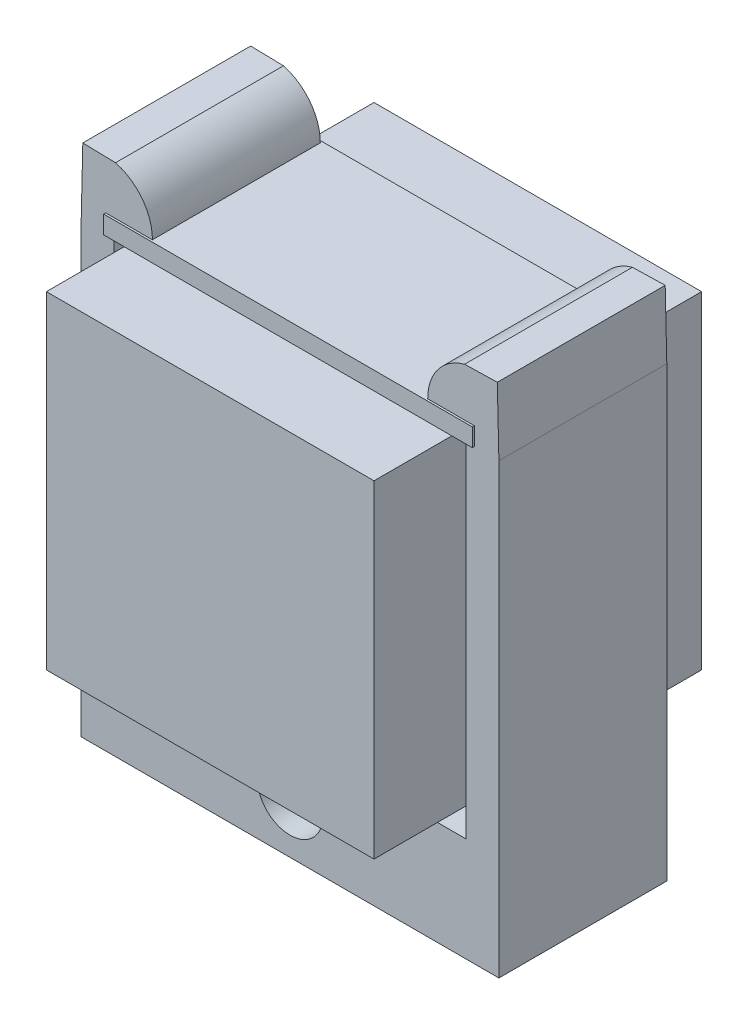
ISO-10303-21;
HEADER;
FILE_DESCRIPTION(('STEP AP214'),'2;1');
FILE_NAME('part.step','',(''),(''),'','','');
FILE_SCHEMA(('AUTOMOTIVE_DESIGN { 1 0 10303 214 1 1 1 1 }'));
ENDSEC;
DATA;
#1=APPLICATION_CONTEXT('core data for automotive mechanical design processes');
#2=APPLICATION_PROTOCOL_DEFINITION('international standard','automotive_design',2000,#1);
#3=PRODUCT_CONTEXT('',#1,'mechanical');
#4=PRODUCT('Part','Part','',(#3));
#5=PRODUCT_RELATED_PRODUCT_CATEGORY('part','',(#4));
#6=PRODUCT_DEFINITION_FORMATION('','',#4);
#7=PRODUCT_DEFINITION_CONTEXT('part definition',#1,'design');
#8=PRODUCT_DEFINITION('design','',#6,#7);
#9=PRODUCT_DEFINITION_SHAPE('','',#8);
#10=(LENGTH_UNIT() NAMED_UNIT(*) SI_UNIT(.MILLI.,.METRE.));
#11=(NAMED_UNIT(*) PLANE_ANGLE_UNIT() SI_UNIT($,.RADIAN.));
#12=(NAMED_UNIT(*) SI_UNIT($,.STERADIAN.) SOLID_ANGLE_UNIT());
#13=UNCERTAINTY_MEASURE_WITH_UNIT(LENGTH_MEASURE(1.E-05),#10,'distance_accuracy_value','');
#14=(GEOMETRIC_REPRESENTATION_CONTEXT(3) GLOBAL_UNCERTAINTY_ASSIGNED_CONTEXT((#13)) GLOBAL_UNIT_ASSIGNED_CONTEXT((#10,
#11,#12)) REPRESENTATION_CONTEXT('',''));
#15=CARTESIAN_POINT('',(0.,0.,0.));
#16=DIRECTION('',(0.,0.,1.));
#17=DIRECTION('',(1.,0.,0.));
#18=AXIS2_PLACEMENT_3D('',#15,#16,#17);
#19=CARTESIAN_POINT('',(-22.8808210284441,2.23350018556867,10.25));
#20=DIRECTION('',(0.,0.,-1.));
#21=DIRECTION('',(-1.,0.,0.));
#22=AXIS2_PLACEMENT_3D('',#19,#20,#21);
#23=CYLINDRICAL_SURFACE('',#22,6.07659216068548);
#24=CARTESIAN_POINT('',(-22.8808210284441,2.23350018556867,-10.25));
#25=DIRECTION('',(0.,0.,1.));
#26=DIRECTION('',(1.,0.,0.));
#27=AXIS2_PLACEMENT_3D('',#24,#25,#26);
#28=CIRCLE('',#27,6.07659216068548);
#29=CARTESIAN_POINT('',(-21.3059505258639,8.10246561291676,-10.25));
#30=VERTEX_POINT('',#29);
#31=CARTESIAN_POINT('',(-16.8059505258639,2.0888604116977,-10.25));
#32=VERTEX_POINT('',#31);
#33=EDGE_CURVE('E201',#30,#32,#28,.F.);
#34=ORIENTED_EDGE('',*,*,#33,.F.);
#35=DIRECTION('',(0.,0.,-1.));
#36=VECTOR('',#35,1.);
#37=CARTESIAN_POINT('',(-21.3059505258639,8.10246561291676,10.25));
#38=LINE('',#37,#36);
#39=CARTESIAN_POINT('',(-21.3059505258639,8.10246561291676,10.25));
#40=VERTEX_POINT('',#39);
#41=EDGE_CURVE('E12',#40,#30,#38,.T.);
#42=ORIENTED_EDGE('',*,*,#41,.F.);
#43=CARTESIAN_POINT('',(-22.8808210284441,2.23350018556867,10.25));
#44=DIRECTION('',(0.,0.,1.));
#45=DIRECTION('',(1.,0.,0.));
#46=AXIS2_PLACEMENT_3D('',#43,#44,#45);
#47=CIRCLE('',#46,6.07659216068548);
#48=CARTESIAN_POINT('',(-16.8059505258639,2.0888604116977,10.25));
#49=VERTEX_POINT('',#48);
#50=EDGE_CURVE('E244',#40,#49,#47,.F.);
#51=ORIENTED_EDGE('',*,*,#50,.T.);
#52=DIRECTION('',(0.,0.,-1.));
#53=VECTOR('',#52,1.);
#54=CARTESIAN_POINT('',(-16.8059505258639,2.0888604116977,10.25));
#55=LINE('',#54,#53);
#56=EDGE_CURVE('E72',#49,#32,#55,.T.);
#57=ORIENTED_EDGE('',*,*,#56,.T.);
#58=EDGE_LOOP('',(#34,#42,#51,#57));
#59=FACE_BOUND('',#58,.T.);
#60=ADVANCED_FACE('F56',(#59),#23,.T.);
#61=CARTESIAN_POINT('',(0.180735187091589,7.59087785784636,10.25));
#62=DIRECTION('',(0.0238027779462901,0.999716673744136,0.));
#63=DIRECTION('',(-0.999716673744136,0.0238027779462901,0.));
#64=AXIS2_PLACEMENT_3D('',#61,#62,#63);
#65=PLANE('',#64);
#66=DIRECTION('',(0.999716673744136,-0.0238027779462901,0.));
#67=VECTOR('',#66,1.);
#68=CARTESIAN_POINT('',(0.180735187091589,7.59087785784636,-10.25));
#69=LINE('',#68,#67);
#70=CARTESIAN_POINT('',(-25.3048172208404,8.19767672470191,-10.25));
#71=VERTEX_POINT('',#70);
#72=EDGE_CURVE('E203',#71,#30,#69,.T.);
#73=ORIENTED_EDGE('',*,*,#72,.F.);
#74=DIRECTION('',(0.,0.,-1.));
#75=VECTOR('',#74,1.);
#76=CARTESIAN_POINT('',(-25.3048172208404,8.19767672470191,10.25));
#77=LINE('',#76,#75);
#78=CARTESIAN_POINT('',(-25.3048172208404,8.19767672470191,10.25));
#79=VERTEX_POINT('',#78);
#80=EDGE_CURVE('E64',#79,#71,#77,.T.);
#81=ORIENTED_EDGE('',*,*,#80,.F.);
#82=DIRECTION('',(0.999716673744136,-0.0238027779462901,0.));
#83=VECTOR('',#82,1.);
#84=CARTESIAN_POINT('',(0.180735187091589,7.59087785784636,10.25));
#85=LINE('',#84,#83);
#86=EDGE_CURVE('E295',#79,#40,#85,.T.);
#87=ORIENTED_EDGE('',*,*,#86,.T.);
#88=ORIENTED_EDGE('',*,*,#41,.T.);
#89=EDGE_LOOP('',(#73,#81,#87,#88));
#90=FACE_BOUND('',#89,.T.);
#91=ADVANCED_FACE('F281',(#90),#65,.T.);
#92=CARTESIAN_POINT('',(-25.485552407932,0.606798866855565,10.25));
#93=DIRECTION('',(-0.999716673744136,0.0238027779462906,0.));
#94=DIRECTION('',(-0.0238027779462906,-0.999716673744136,0.));
#95=AXIS2_PLACEMENT_3D('',#92,#93,#94);
#96=PLANE('',#95);
#97=DIRECTION('',(0.0238027779462906,0.999716673744136,0.));
#98=VECTOR('',#97,1.);
#99=CARTESIAN_POINT('',(-25.485552407932,0.606798866855565,-10.25));
#100=LINE('',#99,#98);
#101=CARTESIAN_POINT('',(-25.5,0.,-10.25));
#102=VERTEX_POINT('',#101);
#103=EDGE_CURVE('E206',#102,#71,#100,.T.);
#104=ORIENTED_EDGE('',*,*,#103,.F.);
#105=DIRECTION('',(0.,0.,-1.));
#106=VECTOR('',#105,1.);
#107=CARTESIAN_POINT('',(-25.5,0.,10.25));
#108=LINE('',#107,#106);
#109=CARTESIAN_POINT('',(-25.5,0.,10.25));
#110=VERTEX_POINT('',#109);
#111=EDGE_CURVE('E270',#110,#102,#108,.T.);
#112=ORIENTED_EDGE('',*,*,#111,.F.);
#113=DIRECTION('',(0.0238027779462906,0.999716673744136,0.));
#114=VECTOR('',#113,1.);
#115=CARTESIAN_POINT('',(-25.485552407932,0.606798866855565,10.25));
#116=LINE('',#115,#114);
#117=EDGE_CURVE('E277',#110,#79,#116,.T.);
#118=ORIENTED_EDGE('',*,*,#117,.T.);
#119=ORIENTED_EDGE('',*,*,#80,.T.);
#120=EDGE_LOOP('',(#104,#112,#118,#119));
#121=FACE_BOUND('',#120,.T.);
#122=ADVANCED_FACE('F275',(#121),#96,.T.);
#123=CARTESIAN_POINT('',(-25.5,0.,10.25));
#124=DIRECTION('',(-1.,0.,0.));
#125=DIRECTION('',(0.,0.,1.));
#126=AXIS2_PLACEMENT_3D('',#123,#124,#125);
#127=PLANE('',#126);
#128=DIRECTION('',(0.,1.,0.));
#129=VECTOR('',#128,1.);
#130=CARTESIAN_POINT('',(-25.5,0.,-10.25));
#131=LINE('',#130,#129);
#132=CARTESIAN_POINT('',(-25.5,-54.7,-10.25));
#133=VERTEX_POINT('',#132);
#134=EDGE_CURVE('E209',#133,#102,#131,.T.);
#135=ORIENTED_EDGE('',*,*,#134,.F.);
#136=DIRECTION('',(0.,0.,-1.));
#137=VECTOR('',#136,1.);
#138=CARTESIAN_POINT('',(-25.5,-54.7,10.25));
#139=LINE('',#138,#137);
#140=CARTESIAN_POINT('',(-25.5,-54.7,10.25));
#141=VERTEX_POINT('',#140);
#142=EDGE_CURVE('E268',#141,#133,#139,.T.);
#143=ORIENTED_EDGE('',*,*,#142,.F.);
#144=DIRECTION('',(0.,1.,0.));
#145=VECTOR('',#144,1.);
#146=CARTESIAN_POINT('',(-25.5,0.,10.25));
#147=LINE('',#146,#145);
#148=EDGE_CURVE('E292',#141,#110,#147,.T.);
#149=ORIENTED_EDGE('',*,*,#148,.T.);
#150=ORIENTED_EDGE('',*,*,#111,.T.);
#151=EDGE_LOOP('',(#135,#143,#149,#150));
#152=FACE_BOUND('',#151,.T.);
#153=ADVANCED_FACE('F289',(#152),#127,.T.);
#154=CARTESIAN_POINT('',(0.,-54.7,10.25));
#155=DIRECTION('',(0.,-1.,0.));
#156=DIRECTION('',(0.,0.,-1.));
#157=AXIS2_PLACEMENT_3D('',#154,#155,#156);
#158=PLANE('',#157);
#159=DIRECTION('',(-1.,0.,0.));
#160=VECTOR('',#159,1.);
#161=CARTESIAN_POINT('',(0.,-54.7,-10.25));
#162=LINE('',#161,#160);
#163=CARTESIAN_POINT('',(25.5,-54.7,-10.25));
#164=VERTEX_POINT('',#163);
#165=EDGE_CURVE('E212',#164,#133,#162,.T.);
#166=ORIENTED_EDGE('',*,*,#165,.F.);
#167=DIRECTION('',(0.,0.,-1.));
#168=VECTOR('',#167,1.);
#169=CARTESIAN_POINT('',(25.5,-54.7,10.25));
#170=LINE('',#169,#168);
#171=CARTESIAN_POINT('',(25.5,-54.7,10.25));
#172=VERTEX_POINT('',#171);
#173=EDGE_CURVE('E266',#172,#164,#170,.T.);
#174=ORIENTED_EDGE('',*,*,#173,.F.);
#175=DIRECTION('',(-1.,0.,0.));
#176=VECTOR('',#175,1.);
#177=CARTESIAN_POINT('',(0.,-54.7,10.25));
#178=LINE('',#177,#176);
#179=EDGE_CURVE('E297',#172,#141,#178,.T.);
#180=ORIENTED_EDGE('',*,*,#179,.T.);
#181=ORIENTED_EDGE('',*,*,#142,.T.);
#182=EDGE_LOOP('',(#166,#174,#180,#181));
#183=FACE_BOUND('',#182,.T.);
#184=ADVANCED_FACE('F344',(#183),#158,.T.);
#185=CARTESIAN_POINT('',(25.5,0.,10.25));
#186=DIRECTION('',(-1.,0.,0.));
#187=DIRECTION('',(0.,0.,1.));
#188=AXIS2_PLACEMENT_3D('',#185,#186,#187);
#189=PLANE('',#188);
#190=DIRECTION('',(0.,1.,0.));
#191=VECTOR('',#190,1.);
#192=CARTESIAN_POINT('',(25.5,0.,-10.25));
#193=LINE('',#192,#191);
#194=CARTESIAN_POINT('',(25.5,0.,-10.25));
#195=VERTEX_POINT('',#194);
#196=EDGE_CURVE('E215',#164,#195,#193,.T.);
#197=ORIENTED_EDGE('',*,*,#196,.T.);
#198=DIRECTION('',(0.,0.,-1.));
#199=VECTOR('',#198,1.);
#200=CARTESIAN_POINT('',(25.5,0.,10.25));
#201=LINE('',#200,#199);
#202=CARTESIAN_POINT('',(25.5,0.,10.25));
#203=VERTEX_POINT('',#202);
#204=EDGE_CURVE('E263',#203,#195,#201,.T.);
#205=ORIENTED_EDGE('',*,*,#204,.F.);
#206=DIRECTION('',(0.,1.,0.));
#207=VECTOR('',#206,1.);
#208=CARTESIAN_POINT('',(25.5,0.,10.25));
#209=LINE('',#208,#207);
#210=EDGE_CURVE('E303',#172,#203,#209,.T.);
#211=ORIENTED_EDGE('',*,*,#210,.F.);
#212=ORIENTED_EDGE('',*,*,#173,.T.);
#213=EDGE_LOOP('',(#197,#205,#211,#212));
#214=FACE_BOUND('',#213,.T.);
#215=ADVANCED_FACE('F347',(#214),#189,.F.);
#216=CARTESIAN_POINT('',(25.485552407932,0.606798866855565,10.25));
#217=DIRECTION('',(-0.999716673744136,-0.0238027779462906,0.));
#218=DIRECTION('',(0.0238027779462906,-0.999716673744136,0.));
#219=AXIS2_PLACEMENT_3D('',#216,#217,#218);
#220=PLANE('',#219);
#221=DIRECTION('',(-0.0238027779462906,0.999716673744136,0.));
#222=VECTOR('',#221,1.);
#223=CARTESIAN_POINT('',(25.485552407932,0.606798866855565,-10.25));
#224=LINE('',#223,#222);
#225=CARTESIAN_POINT('',(25.3048172208404,8.19767672470191,-10.25));
#226=VERTEX_POINT('',#225);
#227=EDGE_CURVE('E217',#195,#226,#224,.T.);
#228=ORIENTED_EDGE('',*,*,#227,.T.);
#229=DIRECTION('',(0.,0.,-1.));
#230=VECTOR('',#229,1.);
#231=CARTESIAN_POINT('',(25.3048172208404,8.19767672470191,10.25));
#232=LINE('',#231,#230);
#233=CARTESIAN_POINT('',(25.3048172208404,8.19767672470191,10.25));
#234=VERTEX_POINT('',#233);
#235=EDGE_CURVE('E260',#234,#226,#232,.T.);
#236=ORIENTED_EDGE('',*,*,#235,.F.);
#237=DIRECTION('',(-0.0238027779462906,0.999716673744136,0.));
#238=VECTOR('',#237,1.);
#239=CARTESIAN_POINT('',(25.485552407932,0.606798866855565,10.25));
#240=LINE('',#239,#238);
#241=EDGE_CURVE('E305',#203,#234,#240,.T.);
#242=ORIENTED_EDGE('',*,*,#241,.F.);
#243=ORIENTED_EDGE('',*,*,#204,.T.);
#244=EDGE_LOOP('',(#228,#236,#242,#243));
#245=FACE_BOUND('',#244,.T.);
#246=ADVANCED_FACE('F351',(#245),#220,.F.);
#247=CARTESIAN_POINT('',(-0.180735187091589,7.59087785784636,10.25));
#248=DIRECTION('',(0.0238027779462901,-0.999716673744136,0.));
#249=DIRECTION('',(0.999716673744136,0.0238027779462901,0.));
#250=AXIS2_PLACEMENT_3D('',#247,#248,#249);
#251=PLANE('',#250);
#252=DIRECTION('',(-0.999716673744136,-0.0238027779462901,0.));
#253=VECTOR('',#252,1.);
#254=CARTESIAN_POINT('',(-0.180735187091589,7.59087785784636,-10.25));
#255=LINE('',#254,#253);
#256=CARTESIAN_POINT('',(21.3059505258639,8.10246561291676,-10.25));
#257=VERTEX_POINT('',#256);
#258=EDGE_CURVE('E219',#226,#257,#255,.T.);
#259=ORIENTED_EDGE('',*,*,#258,.T.);
#260=DIRECTION('',(0.,0.,-1.));
#261=VECTOR('',#260,1.);
#262=CARTESIAN_POINT('',(21.3059505258639,8.10246561291676,10.25));
#263=LINE('',#262,#261);
#264=CARTESIAN_POINT('',(21.3059505258639,8.10246561291676,10.25));
#265=VERTEX_POINT('',#264);
#266=EDGE_CURVE('E257',#265,#257,#263,.T.);
#267=ORIENTED_EDGE('',*,*,#266,.F.);
#268=DIRECTION('',(-0.999716673744136,-0.0238027779462901,0.));
#269=VECTOR('',#268,1.);
#270=CARTESIAN_POINT('',(-0.180735187091589,7.59087785784636,10.25));
#271=LINE('',#270,#269);
#272=EDGE_CURVE('E307',#234,#265,#271,.T.);
#273=ORIENTED_EDGE('',*,*,#272,.F.);
#274=ORIENTED_EDGE('',*,*,#235,.T.);
#275=EDGE_LOOP('',(#259,#267,#273,#274));
#276=FACE_BOUND('',#275,.T.);
#277=ADVANCED_FACE('F355',(#276),#251,.F.);
#278=CARTESIAN_POINT('',(22.8808210284441,2.23350018556867,10.25));
#279=DIRECTION('',(0.,0.,-1.));
#280=DIRECTION('',(-1.,0.,0.));
#281=AXIS2_PLACEMENT_3D('',#278,#279,#280);
#282=CYLINDRICAL_SURFACE('',#281,6.07659216068548);
#283=CARTESIAN_POINT('',(22.8808210284441,2.23350018556867,-10.25));
#284=DIRECTION('',(0.,0.,1.));
#285=DIRECTION('',(1.,0.,0.));
#286=AXIS2_PLACEMENT_3D('',#283,#284,#285);
#287=CIRCLE('',#286,6.07659216068548);
#288=CARTESIAN_POINT('',(16.8059505258639,2.0888604116977,-10.25));
#289=VERTEX_POINT('',#288);
#290=EDGE_CURVE('E221',#257,#289,#287,.T.);
#291=ORIENTED_EDGE('',*,*,#290,.T.);
#292=DIRECTION('',(0.,0.,-1.));
#293=VECTOR('',#292,1.);
#294=CARTESIAN_POINT('',(16.8059505258639,2.0888604116977,10.25));
#295=LINE('',#294,#293);
#296=CARTESIAN_POINT('',(16.8059505258639,2.0888604116977,10.25));
#297=VERTEX_POINT('',#296);
#298=EDGE_CURVE('E254',#297,#289,#295,.T.);
#299=ORIENTED_EDGE('',*,*,#298,.F.);
#300=CARTESIAN_POINT('',(22.8808210284441,2.23350018556867,10.25));
#301=DIRECTION('',(0.,0.,1.));
#302=DIRECTION('',(1.,0.,0.));
#303=AXIS2_PLACEMENT_3D('',#300,#301,#302);
#304=CIRCLE('',#303,6.07659216068548);
#305=EDGE_CURVE('E309',#265,#297,#304,.T.);
#306=ORIENTED_EDGE('',*,*,#305,.F.);
#307=ORIENTED_EDGE('',*,*,#266,.T.);
#308=EDGE_LOOP('',(#291,#299,#306,#307));
#309=FACE_BOUND('',#308,.T.);
#310=ADVANCED_FACE('F359',(#309),#282,.T.);
#311=CARTESIAN_POINT('',(-0.0401848083656906,1.68776195135887,10.25));
#312=DIRECTION('',(-0.0238027779462908,0.999716673744136,0.));
#313=DIRECTION('',(-0.999716673744136,-0.0238027779462908,0.));
#314=AXIS2_PLACEMENT_3D('',#311,#312,#313);
#315=PLANE('',#314);
#316=DIRECTION('',(0.999716673744136,0.0238027779462908,0.));
#317=VECTOR('',#316,1.);
#318=CARTESIAN_POINT('',(-0.0401848083656906,1.68776195135887,-10.25));
#319=LINE('',#318,#317);
#320=CARTESIAN_POINT('',(21.4476338885182,2.1993766822371,-10.25));
#321=VERTEX_POINT('',#320);
#322=EDGE_CURVE('E223',#289,#321,#319,.T.);
#323=ORIENTED_EDGE('',*,*,#322,.T.);
#324=DIRECTION('',(0.,0.,-1.));
#325=VECTOR('',#324,1.);
#326=CARTESIAN_POINT('',(21.4476338885182,2.1993766822371,10.25));
#327=LINE('',#326,#325);
#328=CARTESIAN_POINT('',(21.4476338885182,2.1993766822371,10.25));
#329=VERTEX_POINT('',#328);
#330=EDGE_CURVE('E252',#329,#321,#327,.T.);
#331=ORIENTED_EDGE('',*,*,#330,.F.);
#332=DIRECTION('',(0.999716673744136,0.0238027779462908,0.));
#333=VECTOR('',#332,1.);
#334=CARTESIAN_POINT('',(-0.0401848083656906,1.68776195135887,10.25));
#335=LINE('',#334,#333);
#336=EDGE_CURVE('E311',#297,#329,#335,.T.);
#337=ORIENTED_EDGE('',*,*,#336,.F.);
#338=ORIENTED_EDGE('',*,*,#298,.T.);
#339=EDGE_LOOP('',(#323,#331,#337,#338));
#340=FACE_BOUND('',#339,.T.);
#341=ADVANCED_FACE('F363',(#340),#315,.F.);
#342=CARTESIAN_POINT('',(21.4878186968839,0.511614730878188,10.25));
#343=DIRECTION('',(-0.999716673744136,-0.023802777946289,0.));
#344=DIRECTION('',(0.023802777946289,-0.999716673744136,0.));
#345=AXIS2_PLACEMENT_3D('',#342,#343,#344);
#346=PLANE('',#345);
#347=DIRECTION('',(-0.023802777946289,0.999716673744136,0.));
#348=VECTOR('',#347,1.);
#349=CARTESIAN_POINT('',(21.4878186968839,0.511614730878188,-10.25));
#350=LINE('',#349,#348);
#351=CARTESIAN_POINT('',(21.5,0.,-10.25));
#352=VERTEX_POINT('',#351);
#353=EDGE_CURVE('E226',#352,#321,#350,.T.);
#354=ORIENTED_EDGE('',*,*,#353,.F.);
#355=DIRECTION('',(0.,0.,-1.));
#356=VECTOR('',#355,1.);
#357=CARTESIAN_POINT('',(21.5,0.,10.25));
#358=LINE('',#357,#356);
#359=CARTESIAN_POINT('',(21.5,0.,10.25));
#360=VERTEX_POINT('',#359);
#361=EDGE_CURVE('E250',#360,#352,#358,.T.);
#362=ORIENTED_EDGE('',*,*,#361,.F.);
#363=DIRECTION('',(-0.023802777946289,0.999716673744136,0.));
#364=VECTOR('',#363,1.);
#365=CARTESIAN_POINT('',(21.4878186968839,0.511614730878188,10.25));
#366=LINE('',#365,#364);
#367=EDGE_CURVE('E313',#360,#329,#366,.T.);
#368=ORIENTED_EDGE('',*,*,#367,.T.);
#369=ORIENTED_EDGE('',*,*,#330,.T.);
#370=EDGE_LOOP('',(#354,#362,#368,#369));
#371=FACE_BOUND('',#370,.T.);
#372=ADVANCED_FACE('F367',(#371),#346,.T.);
#373=CARTESIAN_POINT('',(21.5,0.,10.25));
#374=DIRECTION('',(-1.,0.,0.));
#375=DIRECTION('',(0.,0.,1.));
#376=AXIS2_PLACEMENT_3D('',#373,#374,#375);
#377=PLANE('',#376);
#378=DIRECTION('',(0.,1.,0.));
#379=VECTOR('',#378,1.);
#380=CARTESIAN_POINT('',(21.5,0.,-10.25));
#381=LINE('',#380,#379);
#382=CARTESIAN_POINT('',(21.5,-42.,-10.25));
#383=VERTEX_POINT('',#382);
#384=EDGE_CURVE('E229',#383,#352,#381,.T.);
#385=ORIENTED_EDGE('',*,*,#384,.F.);
#386=DIRECTION('',(0.,0.,-1.));
#387=VECTOR('',#386,1.);
#388=CARTESIAN_POINT('',(21.5,-42.,10.25));
#389=LINE('',#388,#387);
#390=CARTESIAN_POINT('',(21.5,-42.,10.25));
#391=VERTEX_POINT('',#390);
#392=EDGE_CURVE('E248',#391,#383,#389,.T.);
#393=ORIENTED_EDGE('',*,*,#392,.F.);
#394=DIRECTION('',(0.,1.,0.));
#395=VECTOR('',#394,1.);
#396=CARTESIAN_POINT('',(21.5,0.,10.25));
#397=LINE('',#396,#395);
#398=EDGE_CURVE('E316',#391,#360,#397,.T.);
#399=ORIENTED_EDGE('',*,*,#398,.T.);
#400=ORIENTED_EDGE('',*,*,#361,.T.);
#401=EDGE_LOOP('',(#385,#393,#399,#400));
#402=FACE_BOUND('',#401,.T.);
#403=ADVANCED_FACE('F371',(#402),#377,.T.);
#404=CARTESIAN_POINT('',(0.,-42.,10.25));
#405=DIRECTION('',(0.,1.,0.));
#406=DIRECTION('',(0.,0.,1.));
#407=AXIS2_PLACEMENT_3D('',#404,#405,#406);
#408=PLANE('',#407);
#409=DIRECTION('',(1.,0.,0.));
#410=VECTOR('',#409,1.);
#411=CARTESIAN_POINT('',(0.,-42.,-10.25));
#412=LINE('',#411,#410);
#413=CARTESIAN_POINT('',(-21.5,-42.,-10.25));
#414=VERTEX_POINT('',#413);
#415=EDGE_CURVE('E232',#414,#383,#412,.T.);
#416=ORIENTED_EDGE('',*,*,#415,.F.);
#417=DIRECTION('',(0.,0.,-1.));
#418=VECTOR('',#417,1.);
#419=CARTESIAN_POINT('',(-21.5,-42.,10.25));
#420=LINE('',#419,#418);
#421=CARTESIAN_POINT('',(-21.5,-42.,10.25));
#422=VERTEX_POINT('',#421);
#423=EDGE_CURVE('E190',#422,#414,#420,.T.);
#424=ORIENTED_EDGE('',*,*,#423,.F.);
#425=DIRECTION('',(1.,0.,0.));
#426=VECTOR('',#425,1.);
#427=CARTESIAN_POINT('',(0.,-42.,10.25));
#428=LINE('',#427,#426);
#429=EDGE_CURVE('E180',#422,#391,#428,.T.);
#430=ORIENTED_EDGE('',*,*,#429,.T.);
#431=ORIENTED_EDGE('',*,*,#392,.T.);
#432=EDGE_LOOP('',(#416,#424,#430,#431));
#433=FACE_BOUND('',#432,.T.);
#434=ADVANCED_FACE('F320',(#433),#408,.T.);
#435=CARTESIAN_POINT('',(-21.5,0.,10.25));
#436=DIRECTION('',(-1.,0.,0.));
#437=DIRECTION('',(0.,0.,1.));
#438=AXIS2_PLACEMENT_3D('',#435,#436,#437);
#439=PLANE('',#438);
#440=DIRECTION('',(0.,1.,0.));
#441=VECTOR('',#440,1.);
#442=CARTESIAN_POINT('',(-21.5,0.,-10.25));
#443=LINE('',#442,#441);
#444=CARTESIAN_POINT('',(-21.5,0.,-10.25));
#445=VERTEX_POINT('',#444);
#446=EDGE_CURVE('E187',#414,#445,#443,.T.);
#447=ORIENTED_EDGE('',*,*,#446,.T.);
#448=DIRECTION('',(0.,0.,-1.));
#449=VECTOR('',#448,1.);
#450=CARTESIAN_POINT('',(-21.5,0.,10.25));
#451=LINE('',#450,#449);
#452=CARTESIAN_POINT('',(-21.5,0.,10.25));
#453=VERTEX_POINT('',#452);
#454=EDGE_CURVE('E184',#453,#445,#451,.T.);
#455=ORIENTED_EDGE('',*,*,#454,.F.);
#456=DIRECTION('',(0.,1.,0.));
#457=VECTOR('',#456,1.);
#458=CARTESIAN_POINT('',(-21.5,0.,10.25));
#459=LINE('',#458,#457);
#460=EDGE_CURVE('E171',#422,#453,#459,.T.);
#461=ORIENTED_EDGE('',*,*,#460,.F.);
#462=ORIENTED_EDGE('',*,*,#423,.T.);
#463=EDGE_LOOP('',(#447,#455,#461,#462));
#464=FACE_BOUND('',#463,.T.);
#465=ADVANCED_FACE('F185',(#464),#439,.F.);
#466=CARTESIAN_POINT('',(-21.4878186968839,0.511614730878188,10.25));
#467=DIRECTION('',(-0.999716673744136,0.023802777946289,0.));
#468=DIRECTION('',(-0.023802777946289,-0.999716673744136,0.));
#469=AXIS2_PLACEMENT_3D('',#466,#467,#468);
#470=PLANE('',#469);
#471=DIRECTION('',(0.023802777946289,0.999716673744136,0.));
#472=VECTOR('',#471,1.);
#473=CARTESIAN_POINT('',(-21.4878186968839,0.511614730878188,-10.25));
#474=LINE('',#473,#472);
#475=CARTESIAN_POINT('',(-21.4476338885182,2.1993766822371,-10.25));
#476=VERTEX_POINT('',#475);
#477=EDGE_CURVE('E236',#445,#476,#474,.T.);
#478=ORIENTED_EDGE('',*,*,#477,.T.);
#479=DIRECTION('',(0.,0.,-1.));
#480=VECTOR('',#479,1.);
#481=CARTESIAN_POINT('',(-21.4476338885182,2.1993766822371,10.25));
#482=LINE('',#481,#480);
#483=CARTESIAN_POINT('',(-21.4476338885182,2.1993766822371,10.25));
#484=VERTEX_POINT('',#483);
#485=EDGE_CURVE('E122',#484,#476,#482,.T.);
#486=ORIENTED_EDGE('',*,*,#485,.F.);
#487=DIRECTION('',(0.023802777946289,0.999716673744136,0.));
#488=VECTOR('',#487,1.);
#489=CARTESIAN_POINT('',(-21.4878186968839,0.511614730878188,10.25));
#490=LINE('',#489,#488);
#491=EDGE_CURVE('E177',#453,#484,#490,.T.);
#492=ORIENTED_EDGE('',*,*,#491,.F.);
#493=ORIENTED_EDGE('',*,*,#454,.T.);
#494=EDGE_LOOP('',(#478,#486,#492,#493));
#495=FACE_BOUND('',#494,.T.);
#496=ADVANCED_FACE('F192',(#495),#470,.F.);
#497=CARTESIAN_POINT('',(0.0401848083656906,1.68776195135887,10.25));
#498=DIRECTION('',(-0.0238027779462908,-0.999716673744136,0.));
#499=DIRECTION('',(0.999716673744136,-0.0238027779462908,0.));
#500=AXIS2_PLACEMENT_3D('',#497,#498,#499);
#501=PLANE('',#500);
#502=DIRECTION('',(-0.999716673744136,0.0238027779462908,0.));
#503=VECTOR('',#502,1.);
#504=CARTESIAN_POINT('',(0.0401848083656906,1.68776195135887,-10.25));
#505=LINE('',#504,#503);
#506=EDGE_CURVE('E238',#32,#476,#505,.T.);
#507=ORIENTED_EDGE('',*,*,#506,.F.);
#508=ORIENTED_EDGE('',*,*,#56,.F.);
#509=DIRECTION('',(-0.999716673744136,0.0238027779462908,0.));
#510=VECTOR('',#509,1.);
#511=CARTESIAN_POINT('',(0.0401848083656906,1.68776195135887,10.25));
#512=LINE('',#511,#510);
#513=EDGE_CURVE('E193',#49,#484,#512,.T.);
#514=ORIENTED_EDGE('',*,*,#513,.T.);
#515=ORIENTED_EDGE('',*,*,#485,.T.);
#516=EDGE_LOOP('',(#507,#508,#514,#515));
#517=FACE_BOUND('',#516,.T.);
#518=ADVANCED_FACE('F322',(#517),#501,.T.);
#519=CARTESIAN_POINT('',(0.,-48.35,10.25));
#520=DIRECTION('',(0.,0.,-1.));
#521=DIRECTION('',(-1.,0.,0.));
#522=AXIS2_PLACEMENT_3D('',#519,#520,#521);
#523=CYLINDRICAL_SURFACE('',#522,4.);
#524=CARTESIAN_POINT('',(0.,-48.35,10.25));
#525=DIRECTION('',(0.,0.,1.));
#526=DIRECTION('',(1.,0.,0.));
#527=AXIS2_PLACEMENT_3D('',#524,#525,#526);
#528=CIRCLE('',#527,4.);
#529=CARTESIAN_POINT('',(4.,-48.35,10.25));
#530=VERTEX_POINT('',#529);
#531=EDGE_CURVE('E195',#530,#530,#528,.T.);
#532=ORIENTED_EDGE('',*,*,#531,.T.);
#533=EDGE_LOOP('',(#532));
#534=FACE_BOUND('',#533,.T.);
#535=CARTESIAN_POINT('',(0.,-48.35,-10.25));
#536=DIRECTION('',(0.,0.,1.));
#537=DIRECTION('',(1.,0.,0.));
#538=AXIS2_PLACEMENT_3D('',#535,#536,#537);
#539=CIRCLE('',#538,4.);
#540=CARTESIAN_POINT('',(4.,-48.35,-10.25));
#541=VERTEX_POINT('',#540);
#542=EDGE_CURVE('E241',#541,#541,#539,.T.);
#543=ORIENTED_EDGE('',*,*,#542,.F.);
#544=EDGE_LOOP('',(#543));
#545=FACE_BOUND('',#544,.T.);
#546=ADVANCED_FACE('F324',(#534,#545),#523,.F.);
#547=CARTESIAN_POINT('',(0.,0.,10.25));
#548=DIRECTION('',(0.,0.,1.));
#549=DIRECTION('',(1.,0.,0.));
#550=AXIS2_PLACEMENT_3D('',#547,#548,#549);
#551=PLANE('',#550);
#552=ORIENTED_EDGE('',*,*,#50,.F.);
#553=ORIENTED_EDGE('',*,*,#86,.F.);
#554=ORIENTED_EDGE('',*,*,#117,.F.);
#555=ORIENTED_EDGE('',*,*,#148,.F.);
#556=ORIENTED_EDGE('',*,*,#179,.F.);
#557=ORIENTED_EDGE('',*,*,#210,.T.);
#558=ORIENTED_EDGE('',*,*,#241,.T.);
#559=ORIENTED_EDGE('',*,*,#272,.T.);
#560=ORIENTED_EDGE('',*,*,#305,.T.);
#561=ORIENTED_EDGE('',*,*,#336,.T.);
#562=ORIENTED_EDGE('',*,*,#367,.F.);
#563=ORIENTED_EDGE('',*,*,#398,.F.);
#564=ORIENTED_EDGE('',*,*,#429,.F.);
#565=ORIENTED_EDGE('',*,*,#460,.T.);
#566=ORIENTED_EDGE('',*,*,#491,.T.);
#567=ORIENTED_EDGE('',*,*,#513,.F.);
#568=EDGE_LOOP('',(#552,#553,#554,#555,#556,#557,#558,#559,#560,#561,#562,#563,#564,#565,#566,#567));
#569=FACE_BOUND('',#568,.T.);
#570=ORIENTED_EDGE('',*,*,#531,.F.);
#571=EDGE_LOOP('',(#570));
#572=FACE_BOUND('',#571,.T.);
#573=ADVANCED_FACE('F173',(#569,#572),#551,.T.);
#574=CARTESIAN_POINT('',(0.,0.,-10.25));
#575=DIRECTION('',(0.,0.,1.));
#576=DIRECTION('',(1.,0.,0.));
#577=AXIS2_PLACEMENT_3D('',#574,#575,#576);
#578=PLANE('',#577);
#579=ORIENTED_EDGE('',*,*,#33,.T.);
#580=ORIENTED_EDGE('',*,*,#506,.T.);
#581=ORIENTED_EDGE('',*,*,#477,.F.);
#582=ORIENTED_EDGE('',*,*,#446,.F.);
#583=ORIENTED_EDGE('',*,*,#415,.T.);
#584=ORIENTED_EDGE('',*,*,#384,.T.);
#585=ORIENTED_EDGE('',*,*,#353,.T.);
#586=ORIENTED_EDGE('',*,*,#322,.F.);
#587=ORIENTED_EDGE('',*,*,#290,.F.);
#588=ORIENTED_EDGE('',*,*,#258,.F.);
#589=ORIENTED_EDGE('',*,*,#227,.F.);
#590=ORIENTED_EDGE('',*,*,#196,.F.);
#591=ORIENTED_EDGE('',*,*,#165,.T.);
#592=ORIENTED_EDGE('',*,*,#134,.T.);
#593=ORIENTED_EDGE('',*,*,#103,.T.);
#594=ORIENTED_EDGE('',*,*,#72,.T.);
#595=EDGE_LOOP('',(#579,#580,#581,#582,#583,#584,#585,#586,#587,#588,#589,#590,#591,#592,#593,#594));
#596=FACE_BOUND('',#595,.T.);
#597=ORIENTED_EDGE('',*,*,#542,.T.);
#598=EDGE_LOOP('',(#597));
#599=FACE_BOUND('',#598,.T.);
#600=ADVANCED_FACE('F283',(#596,#599),#578,.F.);
#601=CLOSED_SHELL('',(#60,#91,#122,#153,#184,#215,#246,#277,#310,#341,#372,#403,#434,#465,#496,
#518,#546,#573,#600));
#602=MANIFOLD_SOLID_BREP('B2',#601);
#603=CARTESIAN_POINT('',(20.,-40.,20.));
#604=DIRECTION('',(1.,0.,0.));
#605=DIRECTION('',(0.,0.,-1.));
#606=AXIS2_PLACEMENT_3D('',#603,#604,#605);
#607=PLANE('',#606);
#608=DIRECTION('',(0.,0.,-1.));
#609=VECTOR('',#608,1.);
#610=CARTESIAN_POINT('',(20.,0.,20.));
#611=LINE('',#610,#609);
#612=CARTESIAN_POINT('',(20.,0.,20.));
#613=VERTEX_POINT('',#612);
#614=CARTESIAN_POINT('',(20.,0.,-20.));
#615=VERTEX_POINT('',#614);
#616=EDGE_CURVE('E654',#613,#615,#611,.T.);
#617=ORIENTED_EDGE('',*,*,#616,.F.);
#618=DIRECTION('',(0.,1.,0.));
#619=VECTOR('',#618,1.);
#620=CARTESIAN_POINT('',(20.,-40.,20.));
#621=LINE('',#620,#619);
#622=CARTESIAN_POINT('',(20.,-40.,20.));
#623=VERTEX_POINT('',#622);
#624=EDGE_CURVE('E54',#623,#613,#621,.T.);
#625=ORIENTED_EDGE('',*,*,#624,.F.);
#626=DIRECTION('',(0.,0.,-1.));
#627=VECTOR('',#626,1.);
#628=CARTESIAN_POINT('',(20.,-40.,20.));
#629=LINE('',#628,#627);
#630=CARTESIAN_POINT('',(20.,-40.,-20.));
#631=VERTEX_POINT('',#630);
#632=EDGE_CURVE('E646',#623,#631,#629,.T.);
#633=ORIENTED_EDGE('',*,*,#632,.T.);
#634=DIRECTION('',(0.,1.,0.));
#635=VECTOR('',#634,1.);
#636=CARTESIAN_POINT('',(20.,-40.,-20.));
#637=LINE('',#636,#635);
#638=EDGE_CURVE('E587',#631,#615,#637,.T.);
#639=ORIENTED_EDGE('',*,*,#638,.T.);
#640=EDGE_LOOP('',(#617,#625,#633,#639));
#641=FACE_BOUND('',#640,.T.);
#642=ADVANCED_FACE('F584',(#641),#607,.T.);
#643=CARTESIAN_POINT('',(-20.,-40.,20.));
#644=DIRECTION('',(0.,0.,1.));
#645=DIRECTION('',(1.,0.,0.));
#646=AXIS2_PLACEMENT_3D('',#643,#644,#645);
#647=PLANE('',#646);
#648=DIRECTION('',(1.,0.,0.));
#649=VECTOR('',#648,1.);
#650=CARTESIAN_POINT('',(-20.,0.,20.));
#651=LINE('',#650,#649);
#652=CARTESIAN_POINT('',(-20.,0.,20.));
#653=VERTEX_POINT('',#652);
#654=EDGE_CURVE('E649',#653,#613,#651,.T.);
#655=ORIENTED_EDGE('',*,*,#654,.F.);
#656=DIRECTION('',(0.,1.,0.));
#657=VECTOR('',#656,1.);
#658=CARTESIAN_POINT('',(-20.,-40.,20.));
#659=LINE('',#658,#657);
#660=CARTESIAN_POINT('',(-20.,-40.,20.));
#661=VERTEX_POINT('',#660);
#662=EDGE_CURVE('E594',#661,#653,#659,.T.);
#663=ORIENTED_EDGE('',*,*,#662,.F.);
#664=DIRECTION('',(1.,0.,0.));
#665=VECTOR('',#664,1.);
#666=CARTESIAN_POINT('',(-20.,-40.,20.));
#667=LINE('',#666,#665);
#668=EDGE_CURVE('E641',#661,#623,#667,.T.);
#669=ORIENTED_EDGE('',*,*,#668,.T.);
#670=ORIENTED_EDGE('',*,*,#624,.T.);
#671=EDGE_LOOP('',(#655,#663,#669,#670));
#672=FACE_BOUND('',#671,.T.);
#673=ADVANCED_FACE('F670',(#672),#647,.T.);
#674=CARTESIAN_POINT('',(-20.,-40.,20.));
#675=DIRECTION('',(-1.,0.,0.));
#676=DIRECTION('',(0.,0.,1.));
#677=AXIS2_PLACEMENT_3D('',#674,#675,#676);
#678=PLANE('',#677);
#679=DIRECTION('',(0.,0.,1.));
#680=VECTOR('',#679,1.);
#681=CARTESIAN_POINT('',(-20.,0.,20.));
#682=LINE('',#681,#680);
#683=CARTESIAN_POINT('',(-20.,0.,-20.));
#684=VERTEX_POINT('',#683);
#685=EDGE_CURVE('E635',#684,#653,#682,.T.);
#686=ORIENTED_EDGE('',*,*,#685,.F.);
#687=DIRECTION('',(0.,1.,0.));
#688=VECTOR('',#687,1.);
#689=CARTESIAN_POINT('',(-20.,-40.,-20.));
#690=LINE('',#689,#688);
#691=CARTESIAN_POINT('',(-20.,-40.,-20.));
#692=VERTEX_POINT('',#691);
#693=EDGE_CURVE('E630',#692,#684,#690,.T.);
#694=ORIENTED_EDGE('',*,*,#693,.F.);
#695=DIRECTION('',(0.,0.,1.));
#696=VECTOR('',#695,1.);
#697=CARTESIAN_POINT('',(-20.,-40.,20.));
#698=LINE('',#697,#696);
#699=EDGE_CURVE('E633',#692,#661,#698,.T.);
#700=ORIENTED_EDGE('',*,*,#699,.T.);
#701=ORIENTED_EDGE('',*,*,#662,.T.);
#702=EDGE_LOOP('',(#686,#694,#700,#701));
#703=FACE_BOUND('',#702,.T.);
#704=ADVANCED_FACE('F632',(#703),#678,.T.);
#705=CARTESIAN_POINT('',(-20.,-40.,-20.));
#706=DIRECTION('',(0.,0.,-1.));
#707=DIRECTION('',(-1.,0.,0.));
#708=AXIS2_PLACEMENT_3D('',#705,#706,#707);
#709=PLANE('',#708);
#710=DIRECTION('',(-1.,0.,0.));
#711=VECTOR('',#710,1.);
#712=CARTESIAN_POINT('',(-20.,0.,-20.));
#713=LINE('',#712,#711);
#714=EDGE_CURVE('E658',#615,#684,#713,.T.);
#715=ORIENTED_EDGE('',*,*,#714,.F.);
#716=ORIENTED_EDGE('',*,*,#638,.F.);
#717=DIRECTION('',(-1.,0.,0.));
#718=VECTOR('',#717,1.);
#719=CARTESIAN_POINT('',(-20.,-40.,-20.));
#720=LINE('',#719,#718);
#721=EDGE_CURVE('E640',#631,#692,#720,.T.);
#722=ORIENTED_EDGE('',*,*,#721,.T.);
#723=ORIENTED_EDGE('',*,*,#693,.T.);
#724=EDGE_LOOP('',(#715,#716,#722,#723));
#725=FACE_BOUND('',#724,.T.);
#726=ADVANCED_FACE('F644',(#725),#709,.T.);
#727=CARTESIAN_POINT('',(0.,-40.,0.));
#728=DIRECTION('',(0.,-1.,0.));
#729=DIRECTION('',(0.,0.,-1.));
#730=AXIS2_PLACEMENT_3D('',#727,#728,#729);
#731=PLANE('',#730);
#732=ORIENTED_EDGE('',*,*,#632,.F.);
#733=ORIENTED_EDGE('',*,*,#668,.F.);
#734=ORIENTED_EDGE('',*,*,#699,.F.);
#735=ORIENTED_EDGE('',*,*,#721,.F.);
#736=EDGE_LOOP('',(#732,#733,#734,#735));
#737=FACE_BOUND('',#736,.T.);
#738=ADVANCED_FACE('F639',(#737),#731,.T.);
#739=CARTESIAN_POINT('',(0.,0.,0.));
#740=DIRECTION('',(0.,-1.,0.));
#741=DIRECTION('',(0.,0.,-1.));
#742=AXIS2_PLACEMENT_3D('',#739,#740,#741);
#743=PLANE('',#742);
#744=ORIENTED_EDGE('',*,*,#616,.T.);
#745=ORIENTED_EDGE('',*,*,#714,.T.);
#746=ORIENTED_EDGE('',*,*,#685,.T.);
#747=ORIENTED_EDGE('',*,*,#654,.T.);
#748=EDGE_LOOP('',(#744,#745,#746,#747));
#749=FACE_BOUND('',#748,.T.);
#750=ADVANCED_FACE('F669',(#749),#743,.F.);
#751=CLOSED_SHELL('',(#642,#673,#704,#726,#738,#750));
#752=MANIFOLD_SOLID_BREP('B6',#751);
#753=CARTESIAN_POINT('',(22.5,2.2,10.5));
#754=DIRECTION('',(-1.,0.,0.));
#755=DIRECTION('',(0.,0.,1.));
#756=AXIS2_PLACEMENT_3D('',#753,#754,#755);
#757=PLANE('',#756);
#758=DIRECTION('',(0.,0.,-1.));
#759=VECTOR('',#758,1.);
#760=CARTESIAN_POINT('',(22.5,0.,10.5));
#761=LINE('',#760,#759);
#762=CARTESIAN_POINT('',(22.5,0.,10.5));
#763=VERTEX_POINT('',#762);
#764=CARTESIAN_POINT('',(22.5,0.,-10.5));
#765=VERTEX_POINT('',#764);
#766=EDGE_CURVE('E795',#763,#765,#761,.T.);
#767=ORIENTED_EDGE('',*,*,#766,.T.);
#768=DIRECTION('',(0.,-1.,0.));
#769=VECTOR('',#768,1.);
#770=CARTESIAN_POINT('',(22.5,2.2,-10.5));
#771=LINE('',#770,#769);
#772=CARTESIAN_POINT('',(22.5,2.2,-10.5));
#773=VERTEX_POINT('',#772);
#774=EDGE_CURVE('E582',#773,#765,#771,.T.);
#775=ORIENTED_EDGE('',*,*,#774,.F.);
#776=DIRECTION('',(0.,0.,-1.));
#777=VECTOR('',#776,1.);
#778=CARTESIAN_POINT('',(22.5,2.2,10.5));
#779=LINE('',#778,#777);
#780=CARTESIAN_POINT('',(22.5,2.2,10.5));
#781=VERTEX_POINT('',#780);
#782=EDGE_CURVE('E783',#781,#773,#779,.T.);
#783=ORIENTED_EDGE('',*,*,#782,.F.);
#784=DIRECTION('',(0.,-1.,0.));
#785=VECTOR('',#784,1.);
#786=CARTESIAN_POINT('',(22.5,2.2,10.5));
#787=LINE('',#786,#785);
#788=EDGE_CURVE('E791',#781,#763,#787,.T.);
#789=ORIENTED_EDGE('',*,*,#788,.T.);
#790=EDGE_LOOP('',(#767,#775,#783,#789));
#791=FACE_BOUND('',#790,.T.);
#792=ADVANCED_FACE('F732',(#791),#757,.F.);
#793=CARTESIAN_POINT('',(-22.5,2.2,-10.5));
#794=DIRECTION('',(0.,0.,1.));
#795=DIRECTION('',(1.,0.,0.));
#796=AXIS2_PLACEMENT_3D('',#793,#794,#795);
#797=PLANE('',#796);
#798=DIRECTION('',(-1.,0.,0.));
#799=VECTOR('',#798,1.);
#800=CARTESIAN_POINT('',(-22.5,0.,-10.5));
#801=LINE('',#800,#799);
#802=CARTESIAN_POINT('',(-22.5,0.,-10.5));
#803=VERTEX_POINT('',#802);
#804=EDGE_CURVE('E787',#765,#803,#801,.T.);
#805=ORIENTED_EDGE('',*,*,#804,.T.);
#806=DIRECTION('',(0.,-1.,0.));
#807=VECTOR('',#806,1.);
#808=CARTESIAN_POINT('',(-22.5,2.2,-10.5));
#809=LINE('',#808,#807);
#810=CARTESIAN_POINT('',(-22.5,2.2,-10.5));
#811=VERTEX_POINT('',#810);
#812=EDGE_CURVE('E740',#811,#803,#809,.T.);
#813=ORIENTED_EDGE('',*,*,#812,.F.);
#814=DIRECTION('',(-1.,0.,0.));
#815=VECTOR('',#814,1.);
#816=CARTESIAN_POINT('',(-22.5,2.2,-10.5));
#817=LINE('',#816,#815);
#818=EDGE_CURVE('E778',#773,#811,#817,.T.);
#819=ORIENTED_EDGE('',*,*,#818,.F.);
#820=ORIENTED_EDGE('',*,*,#774,.T.);
#821=EDGE_LOOP('',(#805,#813,#819,#820));
#822=FACE_BOUND('',#821,.T.);
#823=ADVANCED_FACE('F786',(#822),#797,.F.);
#824=CARTESIAN_POINT('',(-22.5,2.2,10.5));
#825=DIRECTION('',(1.,0.,0.));
#826=DIRECTION('',(0.,0.,-1.));
#827=AXIS2_PLACEMENT_3D('',#824,#825,#826);
#828=PLANE('',#827);
#829=DIRECTION('',(0.,0.,1.));
#830=VECTOR('',#829,1.);
#831=CARTESIAN_POINT('',(-22.5,0.,10.5));
#832=LINE('',#831,#830);
#833=CARTESIAN_POINT('',(-22.5,0.,10.5));
#834=VERTEX_POINT('',#833);
#835=EDGE_CURVE('E765',#803,#834,#832,.T.);
#836=ORIENTED_EDGE('',*,*,#835,.T.);
#837=DIRECTION('',(0.,-1.,0.));
#838=VECTOR('',#837,1.);
#839=CARTESIAN_POINT('',(-22.5,2.2,10.5));
#840=LINE('',#839,#838);
#841=CARTESIAN_POINT('',(-22.5,2.2,10.5));
#842=VERTEX_POINT('',#841);
#843=EDGE_CURVE('E788',#842,#834,#840,.T.);
#844=ORIENTED_EDGE('',*,*,#843,.F.);
#845=DIRECTION('',(0.,0.,1.));
#846=VECTOR('',#845,1.);
#847=CARTESIAN_POINT('',(-22.5,2.2,10.5));
#848=LINE('',#847,#846);
#849=EDGE_CURVE('E781',#811,#842,#848,.T.);
#850=ORIENTED_EDGE('',*,*,#849,.F.);
#851=ORIENTED_EDGE('',*,*,#812,.T.);
#852=EDGE_LOOP('',(#836,#844,#850,#851));
#853=FACE_BOUND('',#852,.T.);
#854=ADVANCED_FACE('F789',(#853),#828,.F.);
#855=CARTESIAN_POINT('',(-22.5,2.2,10.5));
#856=DIRECTION('',(0.,0.,-1.));
#857=DIRECTION('',(-1.,0.,0.));
#858=AXIS2_PLACEMENT_3D('',#855,#856,#857);
#859=PLANE('',#858);
#860=DIRECTION('',(1.,0.,0.));
#861=VECTOR('',#860,1.);
#862=CARTESIAN_POINT('',(-22.5,0.,10.5));
#863=LINE('',#862,#861);
#864=EDGE_CURVE('E771',#834,#763,#863,.T.);
#865=ORIENTED_EDGE('',*,*,#864,.T.);
#866=ORIENTED_EDGE('',*,*,#788,.F.);
#867=DIRECTION('',(1.,0.,0.));
#868=VECTOR('',#867,1.);
#869=CARTESIAN_POINT('',(-22.5,2.2,10.5));
#870=LINE('',#869,#868);
#871=EDGE_CURVE('E748',#842,#781,#870,.T.);
#872=ORIENTED_EDGE('',*,*,#871,.F.);
#873=ORIENTED_EDGE('',*,*,#843,.T.);
#874=EDGE_LOOP('',(#865,#866,#872,#873));
#875=FACE_BOUND('',#874,.T.);
#876=ADVANCED_FACE('F802',(#875),#859,.F.);
#877=CARTESIAN_POINT('',(0.,2.2,0.));
#878=DIRECTION('',(0.,-1.,0.));
#879=DIRECTION('',(0.,0.,-1.));
#880=AXIS2_PLACEMENT_3D('',#877,#878,#879);
#881=PLANE('',#880);
#882=ORIENTED_EDGE('',*,*,#782,.T.);
#883=ORIENTED_EDGE('',*,*,#818,.T.);
#884=ORIENTED_EDGE('',*,*,#849,.T.);
#885=ORIENTED_EDGE('',*,*,#871,.T.);
#886=EDGE_LOOP('',(#882,#883,#884,#885));
#887=FACE_BOUND('',#886,.T.);
#888=ADVANCED_FACE('F779',(#887),#881,.F.);
#889=CARTESIAN_POINT('',(0.,0.,0.));
#890=DIRECTION('',(0.,-1.,0.));
#891=DIRECTION('',(0.,0.,-1.));
#892=AXIS2_PLACEMENT_3D('',#889,#890,#891);
#893=PLANE('',#892);
#894=ORIENTED_EDGE('',*,*,#766,.F.);
#895=ORIENTED_EDGE('',*,*,#864,.F.);
#896=ORIENTED_EDGE('',*,*,#835,.F.);
#897=ORIENTED_EDGE('',*,*,#804,.F.);
#898=EDGE_LOOP('',(#894,#895,#896,#897));
#899=FACE_BOUND('',#898,.T.);
#900=ADVANCED_FACE('F805',(#899),#893,.T.);
#901=CLOSED_SHELL('',(#792,#823,#854,#876,#888,#900));
#902=MANIFOLD_SOLID_BREP('B48',#901);
#903=ADVANCED_BREP_SHAPE_REPRESENTATION('',(#18,#602,#752,#902),#14);
#904=SHAPE_DEFINITION_REPRESENTATION(#9,#903);
ENDSEC;
END-ISO-10303-21;
